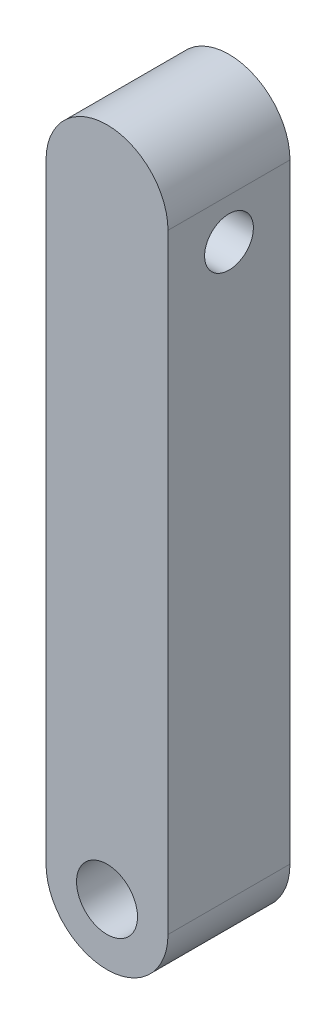
ISO-10303-21;
HEADER;
FILE_DESCRIPTION(('STEP AP214'),'2;1');
FILE_NAME('part.step','',(''),(''),'','','');
FILE_SCHEMA(('AUTOMOTIVE_DESIGN { 1 0 10303 214 1 1 1 1 }'));
ENDSEC;
DATA;
#1=APPLICATION_CONTEXT('core data for automotive mechanical design processes');
#2=APPLICATION_PROTOCOL_DEFINITION('international standard','automotive_design',2000,#1);
#3=PRODUCT_CONTEXT('',#1,'mechanical');
#4=PRODUCT('Part','Part','',(#3));
#5=PRODUCT_RELATED_PRODUCT_CATEGORY('part','',(#4));
#6=PRODUCT_DEFINITION_FORMATION('','',#4);
#7=PRODUCT_DEFINITION_CONTEXT('part definition',#1,'design');
#8=PRODUCT_DEFINITION('design','',#6,#7);
#9=PRODUCT_DEFINITION_SHAPE('','',#8);
#10=(LENGTH_UNIT() NAMED_UNIT(*) SI_UNIT(.MILLI.,.METRE.));
#11=(NAMED_UNIT(*) PLANE_ANGLE_UNIT() SI_UNIT($,.RADIAN.));
#12=(NAMED_UNIT(*) SI_UNIT($,.STERADIAN.) SOLID_ANGLE_UNIT());
#13=UNCERTAINTY_MEASURE_WITH_UNIT(LENGTH_MEASURE(1.E-05),#10,'distance_accuracy_value','');
#14=(GEOMETRIC_REPRESENTATION_CONTEXT(3) GLOBAL_UNCERTAINTY_ASSIGNED_CONTEXT((#13)) GLOBAL_UNIT_ASSIGNED_CONTEXT((#10,
#11,#12)) REPRESENTATION_CONTEXT('',''));
#15=CARTESIAN_POINT('',(0.,0.,0.));
#16=DIRECTION('',(0.,0.,1.));
#17=DIRECTION('',(1.,0.,0.));
#18=AXIS2_PLACEMENT_3D('',#15,#16,#17);
#19=CARTESIAN_POINT('',(0.,-50.,20.));
#20=DIRECTION('',(0.,0.,1.));
#21=DIRECTION('',(1.,0.,0.));
#22=AXIS2_PLACEMENT_3D('',#19,#20,#21);
#23=PLANE('',#22);
#24=CARTESIAN_POINT('',(0.,-50.,20.));
#25=DIRECTION('',(0.,0.,1.));
#26=DIRECTION('',(1.,0.,0.));
#27=AXIS2_PLACEMENT_3D('',#24,#25,#26);
#28=CIRCLE('',#27,10.);
#29=CARTESIAN_POINT('',(-9.99999999999998,-50.,20.));
#30=VERTEX_POINT('',#29);
#31=CARTESIAN_POINT('',(10.,-50.,20.));
#32=VERTEX_POINT('',#31);
#33=EDGE_CURVE('E101',#30,#32,#28,.T.);
#34=ORIENTED_EDGE('',*,*,#33,.T.);
#35=DIRECTION('',(0.,1.,0.));
#36=VECTOR('',#35,1.);
#37=CARTESIAN_POINT('',(10.,-50.,20.));
#38=LINE('',#37,#36);
#39=CARTESIAN_POINT('',(9.99999999999998,50.,20.));
#40=VERTEX_POINT('',#39);
#41=EDGE_CURVE('E96',#32,#40,#38,.T.);
#42=ORIENTED_EDGE('',*,*,#41,.T.);
#43=CARTESIAN_POINT('',(0.,50.,20.));
#44=DIRECTION('',(0.,0.,1.));
#45=DIRECTION('',(1.,0.,0.));
#46=AXIS2_PLACEMENT_3D('',#43,#44,#45);
#47=CIRCLE('',#46,10.);
#48=CARTESIAN_POINT('',(-10.,50.,20.));
#49=VERTEX_POINT('',#48);
#50=EDGE_CURVE('E99',#40,#49,#47,.T.);
#51=ORIENTED_EDGE('',*,*,#50,.T.);
#52=DIRECTION('',(0.,-1.,0.));
#53=VECTOR('',#52,1.);
#54=CARTESIAN_POINT('',(-9.99999999999998,-50.,20.));
#55=LINE('',#54,#53);
#56=EDGE_CURVE('E66',#49,#30,#55,.T.);
#57=ORIENTED_EDGE('',*,*,#56,.T.);
#58=EDGE_LOOP('',(#34,#42,#51,#57));
#59=FACE_BOUND('',#58,.T.);
#60=CARTESIAN_POINT('',(0.,-50.,20.));
#61=DIRECTION('',(0.,0.,1.));
#62=DIRECTION('',(1.,0.,0.));
#63=AXIS2_PLACEMENT_3D('',#60,#61,#62);
#64=CIRCLE('',#63,5.);
#65=CARTESIAN_POINT('',(5.,-50.,20.));
#66=VERTEX_POINT('',#65);
#67=EDGE_CURVE('E117',#66,#66,#64,.T.);
#68=ORIENTED_EDGE('',*,*,#67,.F.);
#69=EDGE_LOOP('',(#68));
#70=FACE_BOUND('',#69,.T.);
#71=ADVANCED_FACE('F48',(#59,#70),#23,.T.);
#72=CARTESIAN_POINT('',(0.,-50.,0.));
#73=DIRECTION('',(0.,0.,1.));
#74=DIRECTION('',(1.,0.,0.));
#75=AXIS2_PLACEMENT_3D('',#72,#73,#74);
#76=PLANE('',#75);
#77=CARTESIAN_POINT('',(0.,-50.,0.));
#78=DIRECTION('',(0.,0.,1.));
#79=DIRECTION('',(1.,0.,0.));
#80=AXIS2_PLACEMENT_3D('',#77,#78,#79);
#81=CIRCLE('',#80,10.);
#82=CARTESIAN_POINT('',(-9.99999999999998,-50.,0.));
#83=VERTEX_POINT('',#82);
#84=CARTESIAN_POINT('',(10.,-50.,0.));
#85=VERTEX_POINT('',#84);
#86=EDGE_CURVE('E114',#83,#85,#81,.T.);
#87=ORIENTED_EDGE('',*,*,#86,.F.);
#88=DIRECTION('',(0.,-1.,0.));
#89=VECTOR('',#88,1.);
#90=CARTESIAN_POINT('',(-9.99999999999998,-50.,0.));
#91=LINE('',#90,#89);
#92=CARTESIAN_POINT('',(-10.,50.,0.));
#93=VERTEX_POINT('',#92);
#94=EDGE_CURVE('E89',#93,#83,#91,.T.);
#95=ORIENTED_EDGE('',*,*,#94,.F.);
#96=CARTESIAN_POINT('',(0.,50.,0.));
#97=DIRECTION('',(0.,0.,1.));
#98=DIRECTION('',(1.,0.,0.));
#99=AXIS2_PLACEMENT_3D('',#96,#97,#98);
#100=CIRCLE('',#99,10.);
#101=CARTESIAN_POINT('',(9.99999999999998,50.,0.));
#102=VERTEX_POINT('',#101);
#103=EDGE_CURVE('E83',#102,#93,#100,.T.);
#104=ORIENTED_EDGE('',*,*,#103,.F.);
#105=DIRECTION('',(0.,1.,0.));
#106=VECTOR('',#105,1.);
#107=CARTESIAN_POINT('',(10.,-50.,0.));
#108=LINE('',#107,#106);
#109=EDGE_CURVE('E105',#85,#102,#108,.T.);
#110=ORIENTED_EDGE('',*,*,#109,.F.);
#111=EDGE_LOOP('',(#87,#95,#104,#110));
#112=FACE_BOUND('',#111,.T.);
#113=CARTESIAN_POINT('',(0.,-50.,0.));
#114=DIRECTION('',(0.,0.,1.));
#115=DIRECTION('',(1.,0.,0.));
#116=AXIS2_PLACEMENT_3D('',#113,#114,#115);
#117=CIRCLE('',#116,5.);
#118=CARTESIAN_POINT('',(5.,-50.,0.));
#119=VERTEX_POINT('',#118);
#120=EDGE_CURVE('E129',#119,#119,#117,.T.);
#121=ORIENTED_EDGE('',*,*,#120,.T.);
#122=EDGE_LOOP('',(#121));
#123=FACE_BOUND('',#122,.T.);
#124=ADVANCED_FACE('F125',(#112,#123),#76,.F.);
#125=CARTESIAN_POINT('',(0.,-50.,20.));
#126=DIRECTION('',(0.,0.,-1.));
#127=DIRECTION('',(-1.,0.,0.));
#128=AXIS2_PLACEMENT_3D('',#125,#126,#127);
#129=CYLINDRICAL_SURFACE('',#128,10.);
#130=ORIENTED_EDGE('',*,*,#86,.T.);
#131=DIRECTION('',(0.,0.,-1.));
#132=VECTOR('',#131,1.);
#133=CARTESIAN_POINT('',(10.,-50.,20.));
#134=LINE('',#133,#132);
#135=EDGE_CURVE('E13',#32,#85,#134,.T.);
#136=ORIENTED_EDGE('',*,*,#135,.F.);
#137=ORIENTED_EDGE('',*,*,#33,.F.);
#138=DIRECTION('',(0.,0.,-1.));
#139=VECTOR('',#138,1.);
#140=CARTESIAN_POINT('',(-9.99999999999998,-50.,20.));
#141=LINE('',#140,#139);
#142=EDGE_CURVE('E110',#30,#83,#141,.T.);
#143=ORIENTED_EDGE('',*,*,#142,.T.);
#144=EDGE_LOOP('',(#130,#136,#137,#143));
#145=FACE_BOUND('',#144,.T.);
#146=ADVANCED_FACE('F50',(#145),#129,.T.);
#147=CARTESIAN_POINT('',(10.,-50.,20.));
#148=DIRECTION('',(-1.,0.,0.));
#149=DIRECTION('',(0.,-1.,0.));
#150=AXIS2_PLACEMENT_3D('',#147,#148,#149);
#151=PLANE('',#150);
#152=CARTESIAN_POINT('',(10.,43.3554095537571,10.));
#153=DIRECTION('',(1.,0.,0.));
#154=DIRECTION('',(0.,1.,0.));
#155=AXIS2_PLACEMENT_3D('',#152,#153,#154);
#156=CIRCLE('',#155,4.00000000000001);
#157=CARTESIAN_POINT('',(10.,47.3554095537571,10.));
#158=VERTEX_POINT('',#157);
#159=EDGE_CURVE('E134',#158,#158,#156,.T.);
#160=ORIENTED_EDGE('',*,*,#159,.F.);
#161=EDGE_LOOP('',(#160));
#162=FACE_BOUND('',#161,.T.);
#163=ORIENTED_EDGE('',*,*,#109,.T.);
#164=DIRECTION('',(0.,0.,-1.));
#165=VECTOR('',#164,1.);
#166=CARTESIAN_POINT('',(9.99999999999998,50.,20.));
#167=LINE('',#166,#165);
#168=EDGE_CURVE('E58',#40,#102,#167,.T.);
#169=ORIENTED_EDGE('',*,*,#168,.F.);
#170=ORIENTED_EDGE('',*,*,#41,.F.);
#171=ORIENTED_EDGE('',*,*,#135,.T.);
#172=EDGE_LOOP('',(#163,#169,#170,#171));
#173=FACE_BOUND('',#172,.T.);
#174=ADVANCED_FACE('F104',(#162,#173),#151,.F.);
#175=CARTESIAN_POINT('',(0.,50.,20.));
#176=DIRECTION('',(0.,0.,-1.));
#177=DIRECTION('',(-1.,0.,0.));
#178=AXIS2_PLACEMENT_3D('',#175,#176,#177);
#179=CYLINDRICAL_SURFACE('',#178,10.);
#180=ORIENTED_EDGE('',*,*,#103,.T.);
#181=DIRECTION('',(0.,0.,-1.));
#182=VECTOR('',#181,1.);
#183=CARTESIAN_POINT('',(-10.,50.,20.));
#184=LINE('',#183,#182);
#185=EDGE_CURVE('E106',#49,#93,#184,.T.);
#186=ORIENTED_EDGE('',*,*,#185,.F.);
#187=ORIENTED_EDGE('',*,*,#50,.F.);
#188=ORIENTED_EDGE('',*,*,#168,.T.);
#189=EDGE_LOOP('',(#180,#186,#187,#188));
#190=FACE_BOUND('',#189,.T.);
#191=ADVANCED_FACE('F108',(#190),#179,.T.);
#192=CARTESIAN_POINT('',(-9.99999999999998,-50.,20.));
#193=DIRECTION('',(1.,0.,0.));
#194=DIRECTION('',(0.,1.,0.));
#195=AXIS2_PLACEMENT_3D('',#192,#193,#194);
#196=PLANE('',#195);
#197=CARTESIAN_POINT('',(-9.99999999999999,43.3554095537571,10.));
#198=DIRECTION('',(1.,0.,0.));
#199=DIRECTION('',(0.,1.,0.));
#200=AXIS2_PLACEMENT_3D('',#197,#198,#199);
#201=CIRCLE('',#200,4.00000000000001);
#202=CARTESIAN_POINT('',(-9.99999999999999,47.3554095537571,10.));
#203=VERTEX_POINT('',#202);
#204=EDGE_CURVE('E52',#203,#203,#201,.T.);
#205=ORIENTED_EDGE('',*,*,#204,.T.);
#206=EDGE_LOOP('',(#205));
#207=FACE_BOUND('',#206,.T.);
#208=ORIENTED_EDGE('',*,*,#94,.T.);
#209=ORIENTED_EDGE('',*,*,#142,.F.);
#210=ORIENTED_EDGE('',*,*,#56,.F.);
#211=ORIENTED_EDGE('',*,*,#185,.T.);
#212=EDGE_LOOP('',(#208,#209,#210,#211));
#213=FACE_BOUND('',#212,.T.);
#214=ADVANCED_FACE('F122',(#207,#213),#196,.F.);
#215=CARTESIAN_POINT('',(0.,-50.,20.));
#216=DIRECTION('',(0.,0.,-1.));
#217=DIRECTION('',(-1.,0.,0.));
#218=AXIS2_PLACEMENT_3D('',#215,#216,#217);
#219=CYLINDRICAL_SURFACE('',#218,5.);
#220=ORIENTED_EDGE('',*,*,#67,.T.);
#221=EDGE_LOOP('',(#220));
#222=FACE_BOUND('',#221,.T.);
#223=ORIENTED_EDGE('',*,*,#120,.F.);
#224=EDGE_LOOP('',(#223));
#225=FACE_BOUND('',#224,.T.);
#226=ADVANCED_FACE('F144',(#222,#225),#219,.F.);
#227=CARTESIAN_POINT('',(-16.,43.3554095537571,10.));
#228=DIRECTION('',(1.,0.,0.));
#229=DIRECTION('',(0.,1.,0.));
#230=AXIS2_PLACEMENT_3D('',#227,#228,#229);
#231=CYLINDRICAL_SURFACE('',#230,4.00000000000001);
#232=CARTESIAN_POINT('',(10.,47.3554095537571,10.));
#233=CARTESIAN_POINT('',(9.79166666666667,47.3554095537571,10.));
#234=CARTESIAN_POINT('',(9.58333333333334,47.3554095537571,10.));
#235=CARTESIAN_POINT('',(9.16666666666667,47.3554095537571,10.));
#236=CARTESIAN_POINT('',(8.95833333333334,47.3554095537571,10.));
#237=CARTESIAN_POINT('',(8.54166666666667,47.3554095537571,10.));
#238=CARTESIAN_POINT('',(8.33333333333334,47.3554095537571,10.));
#239=CARTESIAN_POINT('',(7.91666666666667,47.3554095537571,10.));
#240=CARTESIAN_POINT('',(7.70833333333334,47.3554095537571,10.));
#241=CARTESIAN_POINT('',(7.29166666666667,47.3554095537571,10.));
#242=CARTESIAN_POINT('',(7.08333333333334,47.3554095537571,10.));
#243=CARTESIAN_POINT('',(6.66666666666667,47.3554095537571,10.));
#244=CARTESIAN_POINT('',(6.45833333333334,47.3554095537571,10.));
#245=CARTESIAN_POINT('',(6.04166666666667,47.3554095537571,10.));
#246=CARTESIAN_POINT('',(5.83333333333334,47.3554095537571,10.));
#247=CARTESIAN_POINT('',(5.41666666666667,47.3554095537571,10.));
#248=CARTESIAN_POINT('',(5.20833333333334,47.3554095537571,10.));
#249=CARTESIAN_POINT('',(4.79166666666667,47.3554095537571,10.));
#250=CARTESIAN_POINT('',(4.58333333333334,47.3554095537571,10.));
#251=CARTESIAN_POINT('',(4.16666666666667,47.3554095537571,10.));
#252=CARTESIAN_POINT('',(3.95833333333334,47.3554095537571,10.));
#253=CARTESIAN_POINT('',(3.54166666666667,47.3554095537571,10.));
#254=CARTESIAN_POINT('',(3.33333333333334,47.3554095537571,10.));
#255=CARTESIAN_POINT('',(2.91666666666667,47.3554095537571,10.));
#256=CARTESIAN_POINT('',(2.70833333333334,47.3554095537571,10.));
#257=CARTESIAN_POINT('',(2.29166666666667,47.3554095537571,10.));
#258=CARTESIAN_POINT('',(2.08333333333334,47.3554095537571,10.));
#259=CARTESIAN_POINT('',(1.66666666666667,47.3554095537571,10.));
#260=CARTESIAN_POINT('',(1.45833333333334,47.3554095537571,10.));
#261=CARTESIAN_POINT('',(1.04166666666667,47.3554095537571,10.));
#262=CARTESIAN_POINT('',(0.833333333333337,47.3554095537571,10.));
#263=CARTESIAN_POINT('',(0.416666666666671,47.3554095537571,10.));
#264=CARTESIAN_POINT('',(0.208333333333337,47.3554095537571,10.));
#265=CARTESIAN_POINT('',(-0.20833333333333,47.3554095537571,10.));
#266=CARTESIAN_POINT('',(-0.416666666666662,47.3554095537571,10.));
#267=CARTESIAN_POINT('',(-0.833333333333329,47.3554095537571,10.));
#268=CARTESIAN_POINT('',(-1.04166666666666,47.3554095537571,10.));
#269=CARTESIAN_POINT('',(-1.45833333333333,47.3554095537571,10.));
#270=CARTESIAN_POINT('',(-1.66666666666666,47.3554095537571,10.));
#271=CARTESIAN_POINT('',(-2.08333333333333,47.3554095537571,10.));
#272=CARTESIAN_POINT('',(-2.29166666666666,47.3554095537571,10.));
#273=CARTESIAN_POINT('',(-2.70833333333333,47.3554095537571,10.));
#274=CARTESIAN_POINT('',(-2.91666666666666,47.3554095537571,10.));
#275=CARTESIAN_POINT('',(-3.33333333333333,47.3554095537571,10.));
#276=CARTESIAN_POINT('',(-3.54166666666666,47.3554095537571,10.));
#277=CARTESIAN_POINT('',(-3.95833333333333,47.3554095537571,10.));
#278=CARTESIAN_POINT('',(-4.16666666666666,47.3554095537571,10.));
#279=CARTESIAN_POINT('',(-4.58333333333333,47.3554095537571,10.));
#280=CARTESIAN_POINT('',(-4.79166666666666,47.3554095537571,10.));
#281=CARTESIAN_POINT('',(-5.20833333333333,47.3554095537571,10.));
#282=CARTESIAN_POINT('',(-5.41666666666666,47.3554095537571,10.));
#283=CARTESIAN_POINT('',(-5.83333333333333,47.3554095537571,10.));
#284=CARTESIAN_POINT('',(-6.04166666666666,47.3554095537571,10.));
#285=CARTESIAN_POINT('',(-6.45833333333333,47.3554095537571,10.));
#286=CARTESIAN_POINT('',(-6.66666666666666,47.3554095537571,10.));
#287=CARTESIAN_POINT('',(-7.08333333333333,47.3554095537571,10.));
#288=CARTESIAN_POINT('',(-7.29166666666666,47.3554095537571,10.));
#289=CARTESIAN_POINT('',(-7.70833333333333,47.3554095537571,10.));
#290=CARTESIAN_POINT('',(-7.91666666666666,47.3554095537571,10.));
#291=CARTESIAN_POINT('',(-8.33333333333333,47.3554095537571,10.));
#292=CARTESIAN_POINT('',(-8.54166666666666,47.3554095537571,10.));
#293=CARTESIAN_POINT('',(-8.95833333333333,47.3554095537571,10.));
#294=CARTESIAN_POINT('',(-9.16666666666666,47.3554095537571,10.));
#295=CARTESIAN_POINT('',(-9.58333333333333,47.3554095537571,10.));
#296=CARTESIAN_POINT('',(-9.79166666666666,47.3554095537571,10.));
#297=CARTESIAN_POINT('',(-9.99999999999999,47.3554095537571,10.));
#298=B_SPLINE_CURVE_WITH_KNOTS('',3,(#232,#233,#234,#235,#236,#237,#238,#239,#240,#241,#242,
#243,#244,#245,#246,#247,#248,#249,#250,#251,#252,#253,#254,#255,#256,#257,#258,#259,#260,#261,
#262,#263,#264,#265,#266,#267,#268,#269,#270,#271,#272,#273,#274,#275,#276,#277,#278,#279,#280,
#281,#282,#283,#284,#285,#286,#287,#288,#289,#290,#291,#292,#293,#294,#295,#296,#297),
.UNSPECIFIED.,.F.,.F.,(4,2,2,2,2,2,2,2,2,2,2,2,2,2,2,2,2,2,2,2,2,2,2,2,2,2,2,2,2,2,2,2,4),(0.,
0.625000000000001,1.25,1.875,2.5,3.125,3.75,4.375,5.,5.625,6.25,6.875,7.5,8.125,8.75,9.375,10.,
10.625,11.25,11.875,12.5,13.125,13.75,14.375,15.,15.625,16.25,16.875,17.5,18.125,18.75,19.375,
20.),.UNSPECIFIED.);
#299=EDGE_CURVE('BSEAM142',#158,#203,#298,.T.);
#300=ORIENTED_EDGE('',*,*,#159,.T.);
#301=ORIENTED_EDGE('',*,*,#204,.F.);
#302=ORIENTED_EDGE('',*,*,#299,.T.);
#303=ORIENTED_EDGE('',*,*,#299,.F.);
#304=EDGE_LOOP('',(#300,#302,#301,#303));
#305=FACE_BOUND('',#304,.T.);
#306=ADVANCED_FACE('F142',(#305),#231,.F.);
#307=CLOSED_SHELL('',(#71,#124,#146,#174,#191,#214,#226,#306));
#308=MANIFOLD_SOLID_BREP('B2',#307);
#309=ADVANCED_BREP_SHAPE_REPRESENTATION('',(#18,#308),#14);
#310=SHAPE_DEFINITION_REPRESENTATION(#9,#309);
ENDSEC;
END-ISO-10303-21;
